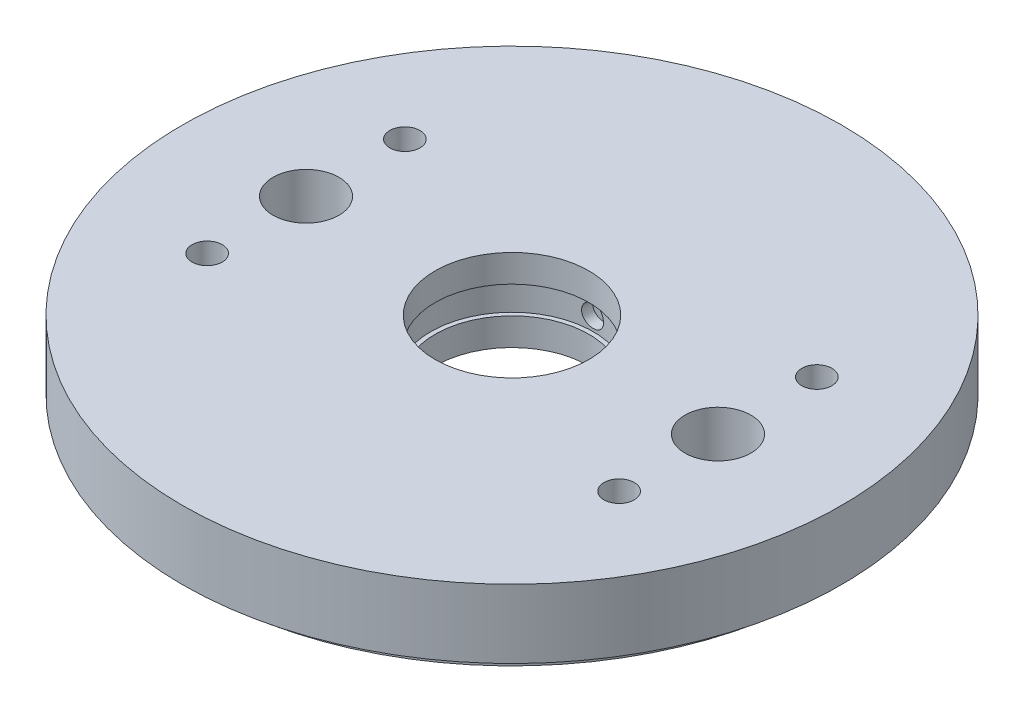
ISO-10303-21;
HEADER;
FILE_DESCRIPTION(('STEP AP214'),'2;1');
FILE_NAME('part.step','',(''),(''),'','','');
FILE_SCHEMA(('AUTOMOTIVE_DESIGN { 1 0 10303 214 1 1 1 1 }'));
ENDSEC;
DATA;
#1=APPLICATION_CONTEXT('core data for automotive mechanical design processes');
#2=APPLICATION_PROTOCOL_DEFINITION('international standard','automotive_design',2000,#1);
#3=PRODUCT_CONTEXT('',#1,'mechanical');
#4=PRODUCT('Part','Part','',(#3));
#5=PRODUCT_RELATED_PRODUCT_CATEGORY('part','',(#4));
#6=PRODUCT_DEFINITION_FORMATION('','',#4);
#7=PRODUCT_DEFINITION_CONTEXT('part definition',#1,'design');
#8=PRODUCT_DEFINITION('design','',#6,#7);
#9=PRODUCT_DEFINITION_SHAPE('','',#8);
#10=(LENGTH_UNIT() NAMED_UNIT(*) SI_UNIT(.MILLI.,.METRE.));
#11=(NAMED_UNIT(*) PLANE_ANGLE_UNIT() SI_UNIT($,.RADIAN.));
#12=(NAMED_UNIT(*) SI_UNIT($,.STERADIAN.) SOLID_ANGLE_UNIT());
#13=UNCERTAINTY_MEASURE_WITH_UNIT(LENGTH_MEASURE(1.E-05),#10,'distance_accuracy_value','');
#14=(GEOMETRIC_REPRESENTATION_CONTEXT(3) GLOBAL_UNCERTAINTY_ASSIGNED_CONTEXT((#13)) GLOBAL_UNIT_ASSIGNED_CONTEXT((#10,
#11,#12)) REPRESENTATION_CONTEXT('',''));
#15=CARTESIAN_POINT('',(0.,0.,0.));
#16=DIRECTION('',(0.,0.,1.));
#17=DIRECTION('',(1.,0.,0.));
#18=AXIS2_PLACEMENT_3D('',#15,#16,#17);
#19=CARTESIAN_POINT('',(0.,-2.5,0.));
#20=DIRECTION('',(0.,1.,0.));
#21=DIRECTION('',(0.,0.,1.));
#22=AXIS2_PLACEMENT_3D('',#19,#20,#21);
#23=CYLINDRICAL_SURFACE('',#22,14.8);
#24=CARTESIAN_POINT('',(0.,-2.5,0.));
#25=DIRECTION('',(0.,1.,0.));
#26=DIRECTION('',(0.,0.,1.));
#27=AXIS2_PLACEMENT_3D('',#24,#25,#26);
#28=CIRCLE('',#27,14.8);
#29=CARTESIAN_POINT('',(0.,-2.5,14.8));
#30=VERTEX_POINT('',#29);
#31=EDGE_CURVE('E61',#30,#30,#28,.T.);
#32=ORIENTED_EDGE('',*,*,#31,.F.);
#33=EDGE_LOOP('',(#32));
#34=FACE_BOUND('',#33,.T.);
#35=CARTESIAN_POINT('',(0.,2.5,0.));
#36=DIRECTION('',(0.,1.,0.));
#37=DIRECTION('',(0.,0.,1.));
#38=AXIS2_PLACEMENT_3D('',#35,#36,#37);
#39=CIRCLE('',#38,14.8);
#40=CARTESIAN_POINT('',(0.,2.5,14.8));
#41=VERTEX_POINT('',#40);
#42=EDGE_CURVE('E75',#41,#41,#39,.T.);
#43=ORIENTED_EDGE('',*,*,#42,.T.);
#44=EDGE_LOOP('',(#43));
#45=FACE_BOUND('',#44,.T.);
#46=CARTESIAN_POINT('',(-2.,0.,-14.6642422238587));
#47=CARTESIAN_POINT('',(-1.99999529578587,-0.111789206027057,-14.6642439407866));
#48=CARTESIAN_POINT('',(-1.99059572714212,-0.223646375467716,-14.6655343330712));
#49=CARTESIAN_POINT('',(-1.95325073253241,-0.444242193801103,-14.670553938447));
#50=CARTESIAN_POINT('',(-1.92528642224589,-0.552977549522505,-14.6742856348113));
#51=CARTESIAN_POINT('',(-1.8516561967299,-0.764104249434412,-14.6837576321533));
#52=CARTESIAN_POINT('',(-1.80600289769559,-0.866500054906773,-14.6894965012858));
#53=CARTESIAN_POINT('',(-1.69831872993679,-1.06216008351143,-14.7023345055794));
#54=CARTESIAN_POINT('',(-1.63629045083665,-1.15542574733752,-14.7094334256063));
#55=CARTESIAN_POINT('',(-1.49718446195897,-1.33080340222723,-14.7242434594185));
#56=CARTESIAN_POINT('',(-1.42002117228851,-1.41284724011534,-14.7319578991606));
#57=CARTESIAN_POINT('',(-1.25302005026385,-1.56286286381146,-14.7470999322923));
#58=CARTESIAN_POINT('',(-1.16318156288561,-1.63083392192353,-14.7545275108323));
#59=CARTESIAN_POINT('',(-0.972948400654116,-1.75102192358299,-14.7682933030086));
#60=CARTESIAN_POINT('',(-0.87251413147463,-1.80317673642567,-14.7746271793963));
#61=CARTESIAN_POINT('',(-0.664212082875051,-1.88985352912222,-14.7854552383821));
#62=CARTESIAN_POINT('',(-0.556344624248892,-1.92437626938271,-14.7899495003143));
#63=CARTESIAN_POINT('',(-0.336937385894213,-1.97460407507685,-14.796568506601));
#64=CARTESIAN_POINT('',(-0.2254240686656,-1.99042281921608,-14.7987075598605));
#65=CARTESIAN_POINT('',(-0.00130658082203191,-2.00314616261992,-14.8004240695127));
#66=CARTESIAN_POINT('',(0.111297539828156,-2.00005162416445,-14.8000016426865));
#67=CARTESIAN_POINT('',(0.333625960086138,-1.97512681206038,-14.7966543092344));
#68=CARTESIAN_POINT('',(0.44336424815575,-1.95341881198866,-14.7937457347353));
#69=CARTESIAN_POINT('',(0.657625951591038,-1.89207472982094,-14.7857711744686));
#70=CARTESIAN_POINT('',(0.762149253892653,-1.85243825921217,-14.7807051419487));
#71=CARTESIAN_POINT('',(0.963389245623299,-1.75623421281881,-14.7689567352304));
#72=CARTESIAN_POINT('',(1.06008060101127,-1.69961427684651,-14.762269374867));
#73=CARTESIAN_POINT('',(1.24263567066565,-1.57108867088602,-14.7480254013326));
#74=CARTESIAN_POINT('',(1.32849880469172,-1.49918218230769,-14.7404687416209));
#75=CARTESIAN_POINT('',(1.48767939507609,-1.34144118747187,-14.725259502793));
#76=CARTESIAN_POINT('',(1.56089118777377,-1.25550003995744,-14.7176066395955));
#77=CARTESIAN_POINT('',(1.6918681733103,-1.07249406202839,-14.7031268072317));
#78=CARTESIAN_POINT('',(1.74963330179108,-0.97542918526948,-14.6962998415067));
#79=CARTESIAN_POINT('',(1.8480863984276,-0.772830795802746,-14.6842449623788));
#80=CARTESIAN_POINT('',(1.88876498530745,-0.667292668677439,-14.6790179278359));
#81=CARTESIAN_POINT('',(1.9517917706359,-0.450796685786435,-14.6707712337009));
#82=CARTESIAN_POINT('',(1.97414100764296,-0.339839137467833,-14.6677514490448));
#83=CARTESIAN_POINT('',(1.99973284108136,-0.116589845541708,-14.6642843923551));
#84=CARTESIAN_POINT('',(2.00312455380969,-0.00431549598699867,-14.6638170440091));
#85=CARTESIAN_POINT('',(1.99109936375072,0.219199875164322,-14.6654546026568));
#86=CARTESIAN_POINT('',(1.97568293148719,0.330440922540928,-14.667559445302));
#87=CARTESIAN_POINT('',(1.92660497787309,0.548279318610916,-14.674085858685));
#88=CARTESIAN_POINT('',(1.89301646048659,0.654893416641846,-14.6784981571703));
#89=CARTESIAN_POINT('',(1.80862324181559,0.860977130088984,-14.6891347663274));
#90=CARTESIAN_POINT('',(1.75781784002699,0.960446454605884,-14.6953591507262));
#91=CARTESIAN_POINT('',(1.64006961992967,1.15008932533665,-14.7089663946664));
#92=CARTESIAN_POINT('',(1.5730294974432,1.24020195345439,-14.7163561420588));
#93=CARTESIAN_POINT('',(1.42485152792593,1.40795011125592,-14.7314401993318));
#94=CARTESIAN_POINT('',(1.34371303775914,1.48558507142527,-14.739134523094));
#95=CARTESIAN_POINT('',(1.16898810331941,1.62670243514653,-14.7540228717902));
#96=CARTESIAN_POINT('',(1.07532189873812,1.69008652976689,-14.7612131992535));
#97=CARTESIAN_POINT('',(0.878585491628291,1.80022089364369,-14.7742273072731));
#98=CARTESIAN_POINT('',(0.775515505547851,1.84697154563299,-14.7800511192716));
#99=CARTESIAN_POINT('',(0.563216372681455,1.92235161424481,-14.7896596863114));
#100=CARTESIAN_POINT('',(0.454007274180482,1.95103666399582,-14.7934506959679));
#101=CARTESIAN_POINT('',(0.232267848176888,1.98965191245769,-14.7985926004645));
#102=CARTESIAN_POINT('',(0.119737697365194,1.99958310711509,-14.7999436248828));
#103=CARTESIAN_POINT('',(-0.104492116428674,2.00038793796832,-14.800052461997));
#104=CARTESIAN_POINT('',(-0.21619125683872,1.99141270529086,-14.7988308395213));
#105=CARTESIAN_POINT('',(-0.436477519972148,1.95498102415107,-14.7939727361505));
#106=CARTESIAN_POINT('',(-0.545064647578227,1.92752460468707,-14.7903362590445));
#107=CARTESIAN_POINT('',(-0.756016275547837,1.85495982137742,-14.7810551256117));
#108=CARTESIAN_POINT('',(-0.858383743191857,1.80985995250338,-14.7754114358368));
#109=CARTESIAN_POINT('',(-1.0541217593421,1.7033042484448,-14.7627388567654));
#110=CARTESIAN_POINT('',(-1.14749212852395,1.64184808734898,-14.7557099398681));
#111=CARTESIAN_POINT('',(-1.32335568077786,1.50376978983375,-14.74098329435));
#112=CARTESIAN_POINT('',(-1.40576040128395,1.42703547560042,-14.7332808703501));
#113=CARTESIAN_POINT('',(-1.55658079211531,1.26081397217681,-14.7181118753614));
#114=CARTESIAN_POINT('',(-1.62499315875848,1.17132377968802,-14.7106453604232));
#115=CARTESIAN_POINT('',(-1.74615707157483,0.981661686414926,-14.696757556328));
#116=CARTESIAN_POINT('',(-1.7988364821515,0.881443362349709,-14.6903411407858));
#117=CARTESIAN_POINT('',(-1.88654028972702,0.673547985707742,-14.6793370684491));
#118=CARTESIAN_POINT('',(-1.92158355240822,0.565879044077429,-14.674747458594));
#119=CARTESIAN_POINT('',(-1.96479702094079,0.381399961469509,-14.6690104760282));
#120=CARTESIAN_POINT('',(-1.97797869556822,0.305744766251739,-14.6672315043511));
#121=CARTESIAN_POINT('',(-1.99558175777549,0.153403710415408,-14.6648467946852));
#122=CARTESIAN_POINT('',(-2.00000322837286,0.076717859570962,-14.6642410455782));
#123=CARTESIAN_POINT('',(-2.,0.,-14.6642422238587));
#124=B_SPLINE_CURVE_WITH_KNOTS('',3,(#46,#47,#48,#49,#50,#51,#52,#53,#54,#55,#56,#57,#58,#59,
#60,#61,#62,#63,#64,#65,#66,#67,#68,#69,#70,#71,#72,#73,#74,#75,#76,#77,#78,#79,#80,#81,#82,#83,
#84,#85,#86,#87,#88,#89,#90,#91,#92,#93,#94,#95,#96,#97,#98,#99,#100,#101,#102,#103,#104,#105,
#106,#107,#108,#109,#110,#111,#112,#113,#114,#115,#116,#117,#118,#119,#120,#121,#122,#123),
.UNSPECIFIED.,.T.,.F.,(4,2,2,2,2,2,2,2,2,2,2,2,2,2,2,2,2,2,2,2,2,2,2,2,2,2,2,2,2,2,2,2,2,2,2,2,
2,2,4),(0.,0.335087300046434,0.670515979029476,1.00570586160471,1.3408427672339,
1.67793235102471,2.01503936118698,2.35345396302519,2.6918539690502,3.02818650705442,
3.36450371135731,3.69862839557102,4.03276032066605,4.36793315475953,4.70312394177703,
5.04099151075062,5.37886048741776,5.71691472755546,6.05494981189334,6.39032219395862,
6.72568618617755,7.05971279493041,7.39375299587,7.7298471274463,8.06595659491222,
8.40431803494195,8.7426716888251,9.07997821915832,9.41726683590973,9.75186952490266,
10.0864716888806,10.420912946428,10.7553608684646,11.0923615498155,11.4294417075121,
11.7680444528262,12.1062842151069,12.336247598554,12.5662088027042),.UNSPECIFIED.);
#125=CARTESIAN_POINT('',(-2.,0.,-14.6642422238587));
#126=VERTEX_POINT('',#125);
#127=EDGE_CURVE('E41',#126,#126,#124,.T.);
#128=ORIENTED_EDGE('',*,*,#127,.F.);
#129=EDGE_LOOP('',(#128));
#130=FACE_BOUND('',#129,.T.);
#131=ADVANCED_FACE('F37',(#34,#45,#130),#23,.F.);
#132=CARTESIAN_POINT('',(0.,-7.5,0.));
#133=DIRECTION('',(0.,1.,0.));
#134=DIRECTION('',(0.,0.,1.));
#135=AXIS2_PLACEMENT_3D('',#132,#133,#134);
#136=CYLINDRICAL_SURFACE('',#135,14.);
#137=CARTESIAN_POINT('',(0.,-7.5,0.));
#138=DIRECTION('',(0.,1.,0.));
#139=DIRECTION('',(0.,0.,1.));
#140=AXIS2_PLACEMENT_3D('',#137,#138,#139);
#141=CIRCLE('',#140,14.);
#142=CARTESIAN_POINT('',(0.,-7.5,14.));
#143=VERTEX_POINT('',#142);
#144=EDGE_CURVE('E103',#143,#143,#141,.T.);
#145=ORIENTED_EDGE('',*,*,#144,.F.);
#146=EDGE_LOOP('',(#145));
#147=FACE_BOUND('',#146,.T.);
#148=CARTESIAN_POINT('',(0.,-2.5,0.));
#149=DIRECTION('',(0.,1.,0.));
#150=DIRECTION('',(0.,0.,1.));
#151=AXIS2_PLACEMENT_3D('',#148,#149,#150);
#152=CIRCLE('',#151,14.);
#153=CARTESIAN_POINT('',(0.,-2.5,14.));
#154=VERTEX_POINT('',#153);
#155=EDGE_CURVE('E60',#154,#154,#152,.F.);
#156=ORIENTED_EDGE('',*,*,#155,.F.);
#157=EDGE_LOOP('',(#156));
#158=FACE_BOUND('',#157,.T.);
#159=ADVANCED_FACE('F136',(#147,#158),#136,.F.);
#160=CARTESIAN_POINT('',(0.,7.5,0.));
#161=DIRECTION('',(0.,-1.,0.));
#162=DIRECTION('',(0.,0.,-1.));
#163=AXIS2_PLACEMENT_3D('',#160,#161,#162);
#164=CYLINDRICAL_SURFACE('',#163,57.);
#165=CARTESIAN_POINT('',(0.,-7.5,0.));
#166=DIRECTION('',(0.,1.,0.));
#167=DIRECTION('',(0.,0.,1.));
#168=AXIS2_PLACEMENT_3D('',#165,#166,#167);
#169=CIRCLE('',#168,57.);
#170=CARTESIAN_POINT('',(0.,-7.5,57.));
#171=VERTEX_POINT('',#170);
#172=EDGE_CURVE('E49',#171,#171,#169,.T.);
#173=ORIENTED_EDGE('',*,*,#172,.T.);
#174=EDGE_LOOP('',(#173));
#175=FACE_BOUND('',#174,.T.);
#176=CARTESIAN_POINT('',(0.,-5.,0.));
#177=DIRECTION('',(0.,1.,0.));
#178=DIRECTION('',(0.,0.,1.));
#179=AXIS2_PLACEMENT_3D('',#176,#177,#178);
#180=CIRCLE('',#179,57.);
#181=CARTESIAN_POINT('',(0.,-5.,57.));
#182=VERTEX_POINT('',#181);
#183=EDGE_CURVE('E12',#182,#182,#180,.T.);
#184=ORIENTED_EDGE('',*,*,#183,.F.);
#185=EDGE_LOOP('',(#184));
#186=FACE_BOUND('',#185,.T.);
#187=ADVANCED_FACE('F39',(#175,#186),#164,.T.);
#188=CARTESIAN_POINT('',(0.,-7.5,0.));
#189=DIRECTION('',(0.,1.,0.));
#190=DIRECTION('',(0.,0.,1.));
#191=AXIS2_PLACEMENT_3D('',#188,#189,#190);
#192=PLANE('',#191);
#193=CARTESIAN_POINT('',(37.4999999999999,-7.5,-18.));
#194=DIRECTION('',(0.,1.,0.));
#195=DIRECTION('',(0.,0.,1.));
#196=AXIS2_PLACEMENT_3D('',#193,#194,#195);
#197=CIRCLE('',#196,2.75);
#198=CARTESIAN_POINT('',(37.4999999999999,-7.5,-15.25));
#199=VERTEX_POINT('',#198);
#200=EDGE_CURVE('E67',#199,#199,#197,.T.);
#201=ORIENTED_EDGE('',*,*,#200,.T.);
#202=EDGE_LOOP('',(#201));
#203=FACE_BOUND('',#202,.T.);
#204=CARTESIAN_POINT('',(37.5000000000001,-7.5,18.));
#205=DIRECTION('',(0.,1.,0.));
#206=DIRECTION('',(0.,0.,1.));
#207=AXIS2_PLACEMENT_3D('',#204,#205,#206);
#208=CIRCLE('',#207,2.75);
#209=CARTESIAN_POINT('',(37.5000000000001,-7.5,20.75));
#210=VERTEX_POINT('',#209);
#211=EDGE_CURVE('E80',#210,#210,#208,.T.);
#212=ORIENTED_EDGE('',*,*,#211,.T.);
#213=EDGE_LOOP('',(#212));
#214=FACE_BOUND('',#213,.T.);
#215=CARTESIAN_POINT('',(-37.4999999999999,-7.5,-18.));
#216=DIRECTION('',(0.,1.,0.));
#217=DIRECTION('',(0.,0.,1.));
#218=AXIS2_PLACEMENT_3D('',#215,#216,#217);
#219=CIRCLE('',#218,2.75);
#220=CARTESIAN_POINT('',(-37.4999999999999,-7.5,-15.25));
#221=VERTEX_POINT('',#220);
#222=EDGE_CURVE('E86',#221,#221,#219,.T.);
#223=ORIENTED_EDGE('',*,*,#222,.T.);
#224=EDGE_LOOP('',(#223));
#225=FACE_BOUND('',#224,.T.);
#226=CARTESIAN_POINT('',(-37.5,-7.5,18.));
#227=DIRECTION('',(0.,1.,0.));
#228=DIRECTION('',(0.,0.,1.));
#229=AXIS2_PLACEMENT_3D('',#226,#227,#228);
#230=CIRCLE('',#229,2.75);
#231=CARTESIAN_POINT('',(-37.5,-7.5,20.75));
#232=VERTEX_POINT('',#231);
#233=EDGE_CURVE('E92',#232,#232,#230,.T.);
#234=ORIENTED_EDGE('',*,*,#233,.T.);
#235=EDGE_LOOP('',(#234));
#236=FACE_BOUND('',#235,.T.);
#237=CARTESIAN_POINT('',(37.5,-7.5,0.));
#238=DIRECTION('',(0.,1.,0.));
#239=DIRECTION('',(0.,0.,1.));
#240=AXIS2_PLACEMENT_3D('',#237,#238,#239);
#241=CIRCLE('',#240,5.99999999999999);
#242=CARTESIAN_POINT('',(37.5,-7.5,5.99999999999998));
#243=VERTEX_POINT('',#242);
#244=EDGE_CURVE('E96',#243,#243,#241,.T.);
#245=ORIENTED_EDGE('',*,*,#244,.T.);
#246=EDGE_LOOP('',(#245));
#247=FACE_BOUND('',#246,.T.);
#248=ORIENTED_EDGE('',*,*,#144,.T.);
#249=EDGE_LOOP('',(#248));
#250=FACE_BOUND('',#249,.T.);
#251=CARTESIAN_POINT('',(-37.5,-7.5,0.));
#252=DIRECTION('',(0.,1.,0.));
#253=DIRECTION('',(0.,0.,1.));
#254=AXIS2_PLACEMENT_3D('',#251,#252,#253);
#255=CIRCLE('',#254,5.99999999999999);
#256=CARTESIAN_POINT('',(-37.5,-7.5,5.99999999999999));
#257=VERTEX_POINT('',#256);
#258=EDGE_CURVE('E108',#257,#257,#255,.T.);
#259=ORIENTED_EDGE('',*,*,#258,.T.);
#260=EDGE_LOOP('',(#259));
#261=FACE_BOUND('',#260,.T.);
#262=ORIENTED_EDGE('',*,*,#172,.F.);
#263=EDGE_LOOP('',(#262));
#264=FACE_BOUND('',#263,.T.);
#265=ADVANCED_FACE('F132',(#203,#214,#225,#236,#247,#250,#261,#264),#192,.F.);
#266=CARTESIAN_POINT('',(0.,-5.,0.));
#267=DIRECTION('',(0.,1.,0.));
#268=DIRECTION('',(0.,0.,1.));
#269=AXIS2_PLACEMENT_3D('',#266,#267,#268);
#270=CYLINDRICAL_SURFACE('',#269,60.);
#271=CARTESIAN_POINT('',(0.,-5.,0.));
#272=DIRECTION('',(0.,1.,0.));
#273=DIRECTION('',(0.,0.,1.));
#274=AXIS2_PLACEMENT_3D('',#271,#272,#273);
#275=CIRCLE('',#274,60.);
#276=CARTESIAN_POINT('',(0.,-5.,60.));
#277=VERTEX_POINT('',#276);
#278=EDGE_CURVE('E54',#277,#277,#275,.T.);
#279=ORIENTED_EDGE('',*,*,#278,.T.);
#280=EDGE_LOOP('',(#279));
#281=FACE_BOUND('',#280,.T.);
#282=CARTESIAN_POINT('',(0.,7.5,0.));
#283=DIRECTION('',(0.,1.,0.));
#284=DIRECTION('',(0.,0.,1.));
#285=AXIS2_PLACEMENT_3D('',#282,#283,#284);
#286=CIRCLE('',#285,60.);
#287=CARTESIAN_POINT('',(0.,7.5,60.));
#288=VERTEX_POINT('',#287);
#289=EDGE_CURVE('E111',#288,#288,#286,.T.);
#290=ORIENTED_EDGE('',*,*,#289,.F.);
#291=EDGE_LOOP('',(#290));
#292=FACE_BOUND('',#291,.T.);
#293=ADVANCED_FACE('F118',(#281,#292),#270,.T.);
#294=CARTESIAN_POINT('',(0.,-5.,0.));
#295=DIRECTION('',(0.,1.,0.));
#296=DIRECTION('',(0.,0.,1.));
#297=AXIS2_PLACEMENT_3D('',#294,#295,#296);
#298=PLANE('',#297);
#299=ORIENTED_EDGE('',*,*,#183,.T.);
#300=EDGE_LOOP('',(#299));
#301=FACE_BOUND('',#300,.T.);
#302=ORIENTED_EDGE('',*,*,#278,.F.);
#303=EDGE_LOOP('',(#302));
#304=FACE_BOUND('',#303,.T.);
#305=ADVANCED_FACE('F121',(#301,#304),#298,.F.);
#306=CARTESIAN_POINT('',(0.,7.5,0.));
#307=DIRECTION('',(0.,1.,0.));
#308=DIRECTION('',(0.,0.,1.));
#309=AXIS2_PLACEMENT_3D('',#306,#307,#308);
#310=PLANE('',#309);
#311=CARTESIAN_POINT('',(37.4999999999999,7.5,-18.));
#312=DIRECTION('',(0.,1.,0.));
#313=DIRECTION('',(0.,0.,1.));
#314=AXIS2_PLACEMENT_3D('',#311,#312,#313);
#315=CIRCLE('',#314,2.74999999999999);
#316=CARTESIAN_POINT('',(37.4999999999999,7.5,-15.25));
#317=VERTEX_POINT('',#316);
#318=EDGE_CURVE('E63',#317,#317,#315,.T.);
#319=ORIENTED_EDGE('',*,*,#318,.F.);
#320=EDGE_LOOP('',(#319));
#321=FACE_BOUND('',#320,.T.);
#322=CARTESIAN_POINT('',(37.5000000000001,7.5,18.));
#323=DIRECTION('',(0.,1.,0.));
#324=DIRECTION('',(0.,0.,1.));
#325=AXIS2_PLACEMENT_3D('',#322,#323,#324);
#326=CIRCLE('',#325,2.74999999999999);
#327=CARTESIAN_POINT('',(37.5000000000001,7.5,20.75));
#328=VERTEX_POINT('',#327);
#329=EDGE_CURVE('E72',#328,#328,#326,.T.);
#330=ORIENTED_EDGE('',*,*,#329,.F.);
#331=EDGE_LOOP('',(#330));
#332=FACE_BOUND('',#331,.T.);
#333=CARTESIAN_POINT('',(-37.4999999999999,7.5,-18.));
#334=DIRECTION('',(0.,1.,0.));
#335=DIRECTION('',(0.,0.,1.));
#336=AXIS2_PLACEMENT_3D('',#333,#334,#335);
#337=CIRCLE('',#336,2.74999999999999);
#338=CARTESIAN_POINT('',(-37.4999999999999,7.5,-15.25));
#339=VERTEX_POINT('',#338);
#340=EDGE_CURVE('E83',#339,#339,#337,.T.);
#341=ORIENTED_EDGE('',*,*,#340,.F.);
#342=EDGE_LOOP('',(#341));
#343=FACE_BOUND('',#342,.T.);
#344=CARTESIAN_POINT('',(-37.5,7.5,18.));
#345=DIRECTION('',(0.,1.,0.));
#346=DIRECTION('',(0.,0.,1.));
#347=AXIS2_PLACEMENT_3D('',#344,#345,#346);
#348=CIRCLE('',#347,2.74999999999999);
#349=CARTESIAN_POINT('',(-37.5,7.5,20.75));
#350=VERTEX_POINT('',#349);
#351=EDGE_CURVE('E89',#350,#350,#348,.T.);
#352=ORIENTED_EDGE('',*,*,#351,.F.);
#353=EDGE_LOOP('',(#352));
#354=FACE_BOUND('',#353,.T.);
#355=CARTESIAN_POINT('',(37.5,7.5,0.));
#356=DIRECTION('',(0.,1.,0.));
#357=DIRECTION('',(0.,0.,1.));
#358=AXIS2_PLACEMENT_3D('',#355,#356,#357);
#359=CIRCLE('',#358,5.99999999999999);
#360=CARTESIAN_POINT('',(37.5,7.5,5.99999999999998));
#361=VERTEX_POINT('',#360);
#362=EDGE_CURVE('E100',#361,#361,#359,.T.);
#363=ORIENTED_EDGE('',*,*,#362,.F.);
#364=EDGE_LOOP('',(#363));
#365=FACE_BOUND('',#364,.T.);
#366=CARTESIAN_POINT('',(0.,7.5,0.));
#367=DIRECTION('',(0.,1.,0.));
#368=DIRECTION('',(0.,0.,1.));
#369=AXIS2_PLACEMENT_3D('',#366,#367,#368);
#370=CIRCLE('',#369,14.);
#371=CARTESIAN_POINT('',(0.,7.5,14.));
#372=VERTEX_POINT('',#371);
#373=EDGE_CURVE('E95',#372,#372,#370,.T.);
#374=ORIENTED_EDGE('',*,*,#373,.F.);
#375=EDGE_LOOP('',(#374));
#376=FACE_BOUND('',#375,.T.);
#377=CARTESIAN_POINT('',(-37.5,7.5,0.));
#378=DIRECTION('',(0.,1.,0.));
#379=DIRECTION('',(0.,0.,1.));
#380=AXIS2_PLACEMENT_3D('',#377,#378,#379);
#381=CIRCLE('',#380,5.99999999999999);
#382=CARTESIAN_POINT('',(-37.5,7.5,5.99999999999999));
#383=VERTEX_POINT('',#382);
#384=EDGE_CURVE('E99',#383,#383,#381,.T.);
#385=ORIENTED_EDGE('',*,*,#384,.F.);
#386=EDGE_LOOP('',(#385));
#387=FACE_BOUND('',#386,.T.);
#388=ORIENTED_EDGE('',*,*,#289,.T.);
#389=EDGE_LOOP('',(#388));
#390=FACE_BOUND('',#389,.T.);
#391=ADVANCED_FACE('F123',(#321,#332,#343,#354,#365,#376,#387,#390),#310,.T.);
#392=CARTESIAN_POINT('',(-37.5,-7.5,0.));
#393=DIRECTION('',(0.,1.,0.));
#394=DIRECTION('',(0.,0.,1.));
#395=AXIS2_PLACEMENT_3D('',#392,#393,#394);
#396=CYLINDRICAL_SURFACE('',#395,5.99999999999999);
#397=ORIENTED_EDGE('',*,*,#258,.F.);
#398=EDGE_LOOP('',(#397));
#399=FACE_BOUND('',#398,.T.);
#400=ORIENTED_EDGE('',*,*,#384,.T.);
#401=EDGE_LOOP('',(#400));
#402=FACE_BOUND('',#401,.T.);
#403=ADVANCED_FACE('F129',(#399,#402),#396,.F.);
#404=CARTESIAN_POINT('',(0.,2.5,0.));
#405=DIRECTION('',(0.,1.,0.));
#406=DIRECTION('',(0.,0.,1.));
#407=AXIS2_PLACEMENT_3D('',#404,#405,#406);
#408=CIRCLE('',#407,14.);
#409=CARTESIAN_POINT('',(0.,2.5,14.));
#410=VERTEX_POINT('',#409);
#411=EDGE_CURVE('E58',#410,#410,#408,.F.);
#412=ORIENTED_EDGE('',*,*,#411,.T.);
#413=EDGE_LOOP('',(#412));
#414=FACE_BOUND('',#413,.T.);
#415=ORIENTED_EDGE('',*,*,#373,.T.);
#416=EDGE_LOOP('',(#415));
#417=FACE_BOUND('',#416,.T.);
#418=ADVANCED_FACE('F145',(#414,#417),#136,.F.);
#419=CARTESIAN_POINT('',(37.5,-7.5,0.));
#420=DIRECTION('',(0.,1.,0.));
#421=DIRECTION('',(0.,0.,1.));
#422=AXIS2_PLACEMENT_3D('',#419,#420,#421);
#423=CYLINDRICAL_SURFACE('',#422,5.99999999999999);
#424=ORIENTED_EDGE('',*,*,#244,.F.);
#425=EDGE_LOOP('',(#424));
#426=FACE_BOUND('',#425,.T.);
#427=ORIENTED_EDGE('',*,*,#362,.T.);
#428=EDGE_LOOP('',(#427));
#429=FACE_BOUND('',#428,.T.);
#430=ADVANCED_FACE('F169',(#426,#429),#423,.F.);
#431=CARTESIAN_POINT('',(-37.5,7.5,18.));
#432=DIRECTION('',(0.,1.,0.));
#433=DIRECTION('',(0.,0.,1.));
#434=AXIS2_PLACEMENT_3D('',#431,#432,#433);
#435=CYLINDRICAL_SURFACE('',#434,2.74999999999999);
#436=ORIENTED_EDGE('',*,*,#233,.F.);
#437=EDGE_LOOP('',(#436));
#438=FACE_BOUND('',#437,.T.);
#439=ORIENTED_EDGE('',*,*,#351,.T.);
#440=EDGE_LOOP('',(#439));
#441=FACE_BOUND('',#440,.T.);
#442=ADVANCED_FACE('F165',(#438,#441),#435,.F.);
#443=CARTESIAN_POINT('',(-37.4999999999999,7.5,-18.));
#444=DIRECTION('',(0.,1.,0.));
#445=DIRECTION('',(0.,0.,1.));
#446=AXIS2_PLACEMENT_3D('',#443,#444,#445);
#447=CYLINDRICAL_SURFACE('',#446,2.74999999999999);
#448=ORIENTED_EDGE('',*,*,#222,.F.);
#449=EDGE_LOOP('',(#448));
#450=FACE_BOUND('',#449,.T.);
#451=ORIENTED_EDGE('',*,*,#340,.T.);
#452=EDGE_LOOP('',(#451));
#453=FACE_BOUND('',#452,.T.);
#454=ADVANCED_FACE('F161',(#450,#453),#447,.F.);
#455=CARTESIAN_POINT('',(37.5000000000001,7.5,18.));
#456=DIRECTION('',(0.,1.,0.));
#457=DIRECTION('',(0.,0.,1.));
#458=AXIS2_PLACEMENT_3D('',#455,#456,#457);
#459=CYLINDRICAL_SURFACE('',#458,2.74999999999999);
#460=ORIENTED_EDGE('',*,*,#211,.F.);
#461=EDGE_LOOP('',(#460));
#462=FACE_BOUND('',#461,.T.);
#463=ORIENTED_EDGE('',*,*,#329,.T.);
#464=EDGE_LOOP('',(#463));
#465=FACE_BOUND('',#464,.T.);
#466=ADVANCED_FACE('F157',(#462,#465),#459,.F.);
#467=CARTESIAN_POINT('',(37.4999999999999,7.5,-18.));
#468=DIRECTION('',(0.,1.,0.));
#469=DIRECTION('',(0.,0.,1.));
#470=AXIS2_PLACEMENT_3D('',#467,#468,#469);
#471=CYLINDRICAL_SURFACE('',#470,2.74999999999999);
#472=ORIENTED_EDGE('',*,*,#200,.F.);
#473=EDGE_LOOP('',(#472));
#474=FACE_BOUND('',#473,.T.);
#475=ORIENTED_EDGE('',*,*,#318,.T.);
#476=EDGE_LOOP('',(#475));
#477=FACE_BOUND('',#476,.T.);
#478=ADVANCED_FACE('F153',(#474,#477),#471,.F.);
#479=CARTESIAN_POINT('',(0.,-2.5,0.));
#480=DIRECTION('',(0.,1.,0.));
#481=DIRECTION('',(0.,0.,1.));
#482=AXIS2_PLACEMENT_3D('',#479,#480,#481);
#483=PLANE('',#482);
#484=ORIENTED_EDGE('',*,*,#31,.T.);
#485=EDGE_LOOP('',(#484));
#486=FACE_BOUND('',#485,.T.);
#487=ORIENTED_EDGE('',*,*,#155,.T.);
#488=EDGE_LOOP('',(#487));
#489=FACE_BOUND('',#488,.T.);
#490=ADVANCED_FACE('F156',(#486,#489),#483,.T.);
#491=CARTESIAN_POINT('',(0.,2.5,0.));
#492=DIRECTION('',(0.,1.,0.));
#493=DIRECTION('',(0.,0.,1.));
#494=AXIS2_PLACEMENT_3D('',#491,#492,#493);
#495=PLANE('',#494);
#496=ORIENTED_EDGE('',*,*,#42,.F.);
#497=EDGE_LOOP('',(#496));
#498=FACE_BOUND('',#497,.T.);
#499=ORIENTED_EDGE('',*,*,#411,.F.);
#500=EDGE_LOOP('',(#499));
#501=FACE_BOUND('',#500,.T.);
#502=ADVANCED_FACE('F151',(#498,#501),#495,.F.);
#503=CARTESIAN_POINT('',(0.,0.,0.));
#504=DIRECTION('',(0.,0.,-1.));
#505=DIRECTION('',(-1.,0.,0.));
#506=AXIS2_PLACEMENT_3D('',#503,#504,#505);
#507=CYLINDRICAL_SURFACE('',#506,2.);
#508=CARTESIAN_POINT('',(-2.,0.,-16.6805275695944));
#509=CARTESIAN_POINT('',(-1.99999521702773,0.111912981585463,-16.6805291092761));
#510=CARTESIAN_POINT('',(-1.99057493231366,0.223896956898408,-16.6816659945707));
#511=CARTESIAN_POINT('',(-1.95314278109255,0.444751409679772,-16.6860892594404));
#512=CARTESIAN_POINT('',(-1.92511121322589,0.553618460137015,-16.6893779167647));
#513=CARTESIAN_POINT('',(-1.85129194973763,0.765009297081991,-16.6977270664711));
#514=CARTESIAN_POINT('',(-1.8055159728756,0.867537218347731,-16.7027863892568));
#515=CARTESIAN_POINT('',(-1.69753176283812,1.06343573867555,-16.7141053957062));
#516=CARTESIAN_POINT('',(-1.63532645559683,1.15680796423862,-16.7203648655788));
#517=CARTESIAN_POINT('',(-1.49591000152839,1.33223974526355,-16.7334145654652));
#518=CARTESIAN_POINT('',(-1.41863197948155,1.41424599066587,-16.7402070771251));
#519=CARTESIAN_POINT('',(-1.25140749678603,1.5641578092307,-16.7535369537174));
#520=CARTESIAN_POINT('',(-1.1614604196144,1.63206269577093,-16.7600743062131));
#521=CARTESIAN_POINT('',(-0.971117864244538,1.75203392975217,-16.7721804623022));
#522=CARTESIAN_POINT('',(-0.87069191932479,1.80405226348228,-16.7777463084254));
#523=CARTESIAN_POINT('',(-0.662452619760682,1.89046635500461,-16.78725730882));
#524=CARTESIAN_POINT('',(-0.554639515052902,1.92486270868403,-16.7912025178923));
#525=CARTESIAN_POINT('',(-0.33523022317376,1.97489781433994,-16.797011667732));
#526=CARTESIAN_POINT('',(-0.223654462935962,1.99062498376776,-16.7988854160347));
#527=CARTESIAN_POINT('',(0.000567381914893939,2.00314919041165,-16.8003739828653));
#528=CARTESIAN_POINT('',(0.113213427973307,1.99994690695697,-16.7999888824575));
#529=CARTESIAN_POINT('',(0.335777020846232,1.97477420162867,-16.7970111003479));
#530=CARTESIAN_POINT('',(0.445705492864176,1.95289886571184,-16.7944296032416));
#531=CARTESIAN_POINT('',(0.660319812418084,1.89114952421506,-16.7873617132715));
#532=CARTESIAN_POINT('',(0.765005568164476,1.85127520363086,-16.7828752870693));
#533=CARTESIAN_POINT('',(0.966458562616065,1.75455785418354,-16.7724824383568));
#534=CARTESIAN_POINT('',(1.06320574550805,1.69767343748066,-16.766572559297));
#535=CARTESIAN_POINT('',(1.24581650098578,1.56858072673998,-16.7539945043923));
#536=CARTESIAN_POINT('',(1.33167962048523,1.49637179510135,-16.7473262970013));
#537=CARTESIAN_POINT('',(1.49064310679441,1.33814666413617,-16.7339295761398));
#538=CARTESIAN_POINT('',(1.56366104283431,1.25204763441093,-16.7272009450995));
#539=CARTESIAN_POINT('',(1.69422143926088,1.06877155993791,-16.7144826510327));
#540=CARTESIAN_POINT('',(1.75176385890509,0.971594486025873,-16.7084929899517));
#541=CARTESIAN_POINT('',(1.84974319317282,0.768849984494345,-16.6979307480532));
#542=CARTESIAN_POINT('',(1.89017389527848,0.663279526098194,-16.6933586820636));
#543=CARTESIAN_POINT('',(1.95271105490751,0.446781400042675,-16.6861595181879));
#544=CARTESIAN_POINT('',(1.97481831085083,0.335853966029357,-16.6835323355567));
#545=CARTESIAN_POINT('',(1.99997267812833,0.112517604660588,-16.6805357102454));
#546=CARTESIAN_POINT('',(2.00313561788459,0.000121900026810181,-16.6801525476071));
#547=CARTESIAN_POINT('',(1.9906168174558,-0.223597816465263,-16.6816510833524));
#548=CARTESIAN_POINT('',(1.97493544072991,-0.334921848951655,-16.6835327380535));
#549=CARTESIAN_POINT('',(1.92527051173379,-0.552993484102836,-16.6893363861405));
#550=CARTESIAN_POINT('',(1.89134270530046,-0.659753962311116,-16.6932521637117));
#551=CARTESIAN_POINT('',(1.80620526337886,-0.8660700836985,-16.7026778133762));
#552=CARTESIAN_POINT('',(1.7549950744246,-0.965625496012318,-16.7081877365211));
#553=CARTESIAN_POINT('',(1.63646036706895,-1.1552305281874,-16.720213809793));
#554=CARTESIAN_POINT('',(1.5690596851758,-1.24523223010878,-16.726734662531));
#555=CARTESIAN_POINT('',(1.42016530035133,-1.41268687813336,-16.740032943455));
#556=CARTESIAN_POINT('',(1.33867110108157,-1.49013938209905,-16.7468103806708));
#557=CARTESIAN_POINT('',(1.16339791207259,-1.63070200735862,-16.7599001517596));
#558=CARTESIAN_POINT('',(1.0695577772168,-1.69373615839748,-16.7662099087321));
#559=CARTESIAN_POINT('',(0.872555041327783,-1.80314785455925,-16.7776151236743));
#560=CARTESIAN_POINT('',(0.76939261314862,-1.84952570844412,-16.7827106041527));
#561=CARTESIAN_POINT('',(0.556929411775422,-1.92418201285919,-16.7911016607987));
#562=CARTESIAN_POINT('',(0.447644426329686,-1.95250487697047,-16.7944016507493));
#563=CARTESIAN_POINT('',(0.225828329860469,-1.99039183062441,-16.7988481838214));
#564=CARTESIAN_POINT('',(0.113297351123307,-1.999956683533,-16.7999948145748));
#565=CARTESIAN_POINT('',(-0.111073486272895,-2.0000427576687,-16.8000051187242));
#566=CARTESIAN_POINT('',(-0.222913317517294,-1.99068132239542,-16.7988828593011));
#567=CARTESIAN_POINT('',(-0.443418509101867,-1.95342845001661,-16.794509376336));
#568=CARTESIAN_POINT('',(-0.552083870274315,-1.92553701776927,-16.7912581533521));
#569=CARTESIAN_POINT('',(-0.763143794842564,-1.85205165617288,-16.782990552824));
#570=CARTESIAN_POINT('',(-0.865540144921187,-1.80646279807829,-16.7779746809841));
#571=CARTESIAN_POINT('',(-1.06124728305247,-1.69888885438346,-16.7667341448953));
#572=CARTESIAN_POINT('',(-1.15455800401709,-1.6369036477256,-16.7605094717216));
#573=CARTESIAN_POINT('',(-1.3300452988054,-1.49786059719657,-16.7475007177847));
#574=CARTESIAN_POINT('',(-1.41215240522587,-1.42071536415446,-16.7407135322533));
#575=CARTESIAN_POINT('',(-1.56230279421461,-1.25372219661915,-16.7273700142393));
#576=CARTESIAN_POINT('',(-1.63034273113475,-1.16387124881469,-16.7208137369815));
#577=CARTESIAN_POINT('',(-1.75062848818711,-0.973658587256594,-16.7086498205249));
#578=CARTESIAN_POINT('',(-1.8028180211501,-0.873261080667818,-16.7030455925263));
#579=CARTESIAN_POINT('',(-1.88952382817448,-0.665118493017267,-16.6934603883795));
#580=CARTESIAN_POINT('',(-1.92405950858009,-0.557381628229657,-16.689477630783));
#581=CARTESIAN_POINT('',(-1.96611971234091,-0.374227534341,-16.6845630694677));
#582=CARTESIAN_POINT('',(-1.97880678730024,-0.299969934804937,-16.6830571943502));
#583=CARTESIAN_POINT('',(-1.99574851138916,-0.15048558759586,-16.6810389300077));
#584=CARTESIAN_POINT('',(-2.00000321643629,-0.0752588463528398,-16.6805265341948));
#585=CARTESIAN_POINT('',(-2.,0.,-16.6805275695944));
#586=B_SPLINE_CURVE_WITH_KNOTS('',3,(#508,#509,#510,#511,#512,#513,#514,#515,#516,#517,#518,
#519,#520,#521,#522,#523,#524,#525,#526,#527,#528,#529,#530,#531,#532,#533,#534,#535,#536,#537,
#538,#539,#540,#541,#542,#543,#544,#545,#546,#547,#548,#549,#550,#551,#552,#553,#554,#555,#556,
#557,#558,#559,#560,#561,#562,#563,#564,#565,#566,#567,#568,#569,#570,#571,#572,#573,#574,#575,
#576,#577,#578,#579,#580,#581,#582,#583,#584,#585),.UNSPECIFIED.,.T.,.F.,(4,2,2,2,2,2,2,2,2,2,2,
2,2,2,2,2,2,2,2,2,2,2,2,2,2,2,2,2,2,2,2,2,2,2,2,2,2,2,4),(0.,0.335464038849132,
0.671283757503219,1.00688207097411,1.34242065728652,1.67948330579682,2.01656236268913,
2.35465031106137,2.69272682623577,3.02919573699581,3.3656525728278,3.70040627157822,
4.03516582915504,4.37074662238831,4.70634138073283,5.04401685387889,5.38169321601606,
5.71949206875788,6.0572762015873,6.39299294539448,6.7287032141796,7.06339361164216,
7.39809472853695,7.73440229495669,8.07072170770057,8.40877433717961,8.7468206997687,
9.08403225806479,9.42123009309588,9.75634370411969,10.0914572272835,10.4264747933868,
10.7614948330632,11.0985059379406,11.4355971034738,11.7738716984883,12.1117736344999,
12.3373668017853,12.5629584730908),.UNSPECIFIED.);
#587=CARTESIAN_POINT('',(-2.,0.,-16.6805275695944));
#588=VERTEX_POINT('',#587);
#589=EDGE_CURVE('E290',#588,#588,#586,.T.);
#590=ORIENTED_EDGE('',*,*,#589,.T.);
#591=EDGE_LOOP('',(#590));
#592=FACE_BOUND('',#591,.T.);
#593=ORIENTED_EDGE('',*,*,#127,.T.);
#594=EDGE_LOOP('',(#593));
#595=FACE_BOUND('',#594,.T.);
#596=ADVANCED_FACE('F259',(#592,#595),#507,.F.);
#597=CARTESIAN_POINT('',(0.,-2.5,0.));
#598=DIRECTION('',(0.,1.,0.));
#599=DIRECTION('',(0.,0.,1.));
#600=AXIS2_PLACEMENT_3D('',#597,#598,#599);
#601=CYLINDRICAL_SURFACE('',#600,16.8);
#602=ORIENTED_EDGE('',*,*,#589,.F.);
#603=EDGE_LOOP('',(#602));
#604=FACE_BOUND('',#603,.T.);
#605=ADVANCED_FACE('F273',(#604),#601,.F.);
#606=CLOSED_SHELL('',(#131,#159,#187,#265,#293,#305,#391,#403,#418,#430,#442,#454,#466,#478,
#490,#502,#596,#605));
#607=MANIFOLD_SOLID_BREP('B2',#606);
#608=ADVANCED_BREP_SHAPE_REPRESENTATION('',(#18,#607),#14);
#609=SHAPE_DEFINITION_REPRESENTATION(#9,#608);
ENDSEC;
END-ISO-10303-21;
